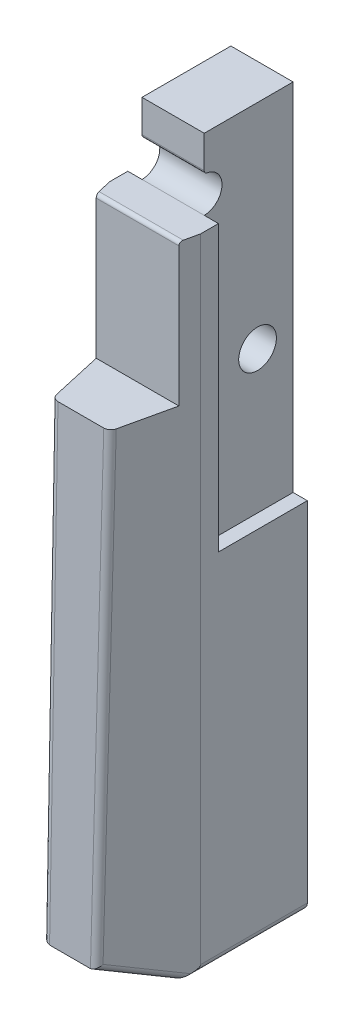
ISO-10303-21;
HEADER;
FILE_DESCRIPTION(('STEP AP214'),'2;1');
FILE_NAME('part.step','',(''),(''),'','','');
FILE_SCHEMA(('AUTOMOTIVE_DESIGN { 1 0 10303 214 1 1 1 1 }'));
ENDSEC;
DATA;
#1=APPLICATION_CONTEXT('core data for automotive mechanical design processes');
#2=APPLICATION_PROTOCOL_DEFINITION('international standard','automotive_design',2000,#1);
#3=PRODUCT_CONTEXT('',#1,'mechanical');
#4=PRODUCT('Part','Part','',(#3));
#5=PRODUCT_RELATED_PRODUCT_CATEGORY('part','',(#4));
#6=PRODUCT_DEFINITION_FORMATION('','',#4);
#7=PRODUCT_DEFINITION_CONTEXT('part definition',#1,'design');
#8=PRODUCT_DEFINITION('design','',#6,#7);
#9=PRODUCT_DEFINITION_SHAPE('','',#8);
#10=(LENGTH_UNIT() NAMED_UNIT(*) SI_UNIT(.MILLI.,.METRE.));
#11=(NAMED_UNIT(*) PLANE_ANGLE_UNIT() SI_UNIT($,.RADIAN.));
#12=(NAMED_UNIT(*) SI_UNIT($,.STERADIAN.) SOLID_ANGLE_UNIT());
#13=UNCERTAINTY_MEASURE_WITH_UNIT(LENGTH_MEASURE(1.E-05),#10,'distance_accuracy_value','');
#14=(GEOMETRIC_REPRESENTATION_CONTEXT(3) GLOBAL_UNCERTAINTY_ASSIGNED_CONTEXT((#13)) GLOBAL_UNIT_ASSIGNED_CONTEXT((#10,
#11,#12)) REPRESENTATION_CONTEXT('',''));
#15=CARTESIAN_POINT('',(0.,0.,0.));
#16=DIRECTION('',(0.,0.,1.));
#17=DIRECTION('',(1.,0.,0.));
#18=AXIS2_PLACEMENT_3D('',#15,#16,#17);
#19=CARTESIAN_POINT('',(0.5,0.,0.));
#20=DIRECTION('',(1.,0.,0.));
#21=DIRECTION('',(0.,0.,-1.));
#22=AXIS2_PLACEMENT_3D('',#19,#20,#21);
#23=PLANE('',#22);
#24=DIRECTION('',(0.,0.,-1.));
#25=VECTOR('',#24,1.);
#26=CARTESIAN_POINT('',(0.5,90.,17.5));
#27=LINE('',#26,#25);
#28=CARTESIAN_POINT('',(0.5,90.,15.));
#29=VERTEX_POINT('',#28);
#30=CARTESIAN_POINT('',(0.5,90.,12.5));
#31=VERTEX_POINT('',#30);
#32=EDGE_CURVE('E501',#29,#31,#27,.T.);
#33=ORIENTED_EDGE('',*,*,#32,.F.);
#34=DIRECTION('',(0.,-1.,0.));
#35=VECTOR('',#34,1.);
#36=CARTESIAN_POINT('',(0.5,267.953311212288,15.));
#37=LINE('',#36,#35);
#38=CARTESIAN_POINT('',(0.5,1.,15.));
#39=VERTEX_POINT('',#38);
#40=EDGE_CURVE('E516',#29,#39,#37,.T.);
#41=ORIENTED_EDGE('',*,*,#40,.T.);
#42=DIRECTION('',(0.,0.,-1.));
#43=VECTOR('',#42,1.);
#44=CARTESIAN_POINT('',(0.5,1.,0.));
#45=LINE('',#44,#43);
#46=CARTESIAN_POINT('',(0.5,1.,0.));
#47=VERTEX_POINT('',#46);
#48=EDGE_CURVE('E379',#39,#47,#45,.T.);
#49=ORIENTED_EDGE('',*,*,#48,.T.);
#50=DIRECTION('',(0.,1.,0.));
#51=VECTOR('',#50,1.);
#52=CARTESIAN_POINT('',(0.5,0.,0.));
#53=LINE('',#52,#51);
#54=CARTESIAN_POINT('',(0.5,50.,0.));
#55=VERTEX_POINT('',#54);
#56=EDGE_CURVE('E537',#47,#55,#53,.T.);
#57=ORIENTED_EDGE('',*,*,#56,.T.);
#58=DIRECTION('',(0.,0.,1.));
#59=VECTOR('',#58,1.);
#60=CARTESIAN_POINT('',(0.5,50.,12.5));
#61=LINE('',#60,#59);
#62=CARTESIAN_POINT('',(0.5,50.,12.5));
#63=VERTEX_POINT('',#62);
#64=EDGE_CURVE('E539',#55,#63,#61,.T.);
#65=ORIENTED_EDGE('',*,*,#64,.T.);
#66=DIRECTION('',(0.,1.,0.));
#67=VECTOR('',#66,1.);
#68=CARTESIAN_POINT('',(0.5,50.,12.5));
#69=LINE('',#68,#67);
#70=EDGE_CURVE('E542',#63,#31,#69,.T.);
#71=ORIENTED_EDGE('',*,*,#70,.T.);
#72=EDGE_LOOP('',(#33,#41,#49,#57,#65,#71));
#73=FACE_BOUND('',#72,.T.);
#74=ADVANCED_FACE('F43',(#73),#23,.T.);
#75=CARTESIAN_POINT('',(0.,100.,17.5));
#76=DIRECTION('',(0.,-1.,0.));
#77=DIRECTION('',(0.,0.,-1.));
#78=AXIS2_PLACEMENT_3D('',#75,#76,#77);
#79=PLANE('',#78);
#80=DIRECTION('',(0.,0.,1.));
#81=VECTOR('',#80,1.);
#82=CARTESIAN_POINT('',(-10.25,100.,0.));
#83=LINE('',#82,#81);
#84=CARTESIAN_POINT('',(-10.25,100.,0.));
#85=VERTEX_POINT('',#84);
#86=CARTESIAN_POINT('',(-10.25,100.,12.5));
#87=VERTEX_POINT('',#86);
#88=EDGE_CURVE('E234',#85,#87,#83,.T.);
#89=ORIENTED_EDGE('',*,*,#88,.T.);
#90=DIRECTION('',(1.,0.,0.));
#91=VECTOR('',#90,1.);
#92=CARTESIAN_POINT('',(-12.251,100.,12.5));
#93=LINE('',#92,#91);
#94=CARTESIAN_POINT('',(-1.5,100.,12.5));
#95=VERTEX_POINT('',#94);
#96=EDGE_CURVE('E216',#87,#95,#93,.T.);
#97=ORIENTED_EDGE('',*,*,#96,.T.);
#98=DIRECTION('',(0.,0.,1.));
#99=VECTOR('',#98,1.);
#100=CARTESIAN_POINT('',(-1.5,100.,0.));
#101=LINE('',#100,#99);
#102=CARTESIAN_POINT('',(-1.5,100.,0.));
#103=VERTEX_POINT('',#102);
#104=EDGE_CURVE('E265',#103,#95,#101,.T.);
#105=ORIENTED_EDGE('',*,*,#104,.F.);
#106=DIRECTION('',(-1.,0.,0.));
#107=VECTOR('',#106,1.);
#108=CARTESIAN_POINT('',(0.,100.,0.));
#109=LINE('',#108,#107);
#110=EDGE_CURVE('E243',#103,#85,#109,.T.);
#111=ORIENTED_EDGE('',*,*,#110,.T.);
#112=EDGE_LOOP('',(#89,#97,#105,#111));
#113=FACE_BOUND('',#112,.T.);
#114=ADVANCED_FACE('F241',(#113),#79,.F.);
#115=CARTESIAN_POINT('',(0.,0.,17.5));
#116=DIRECTION('',(0.,1.,0.));
#117=DIRECTION('',(0.,0.,1.));
#118=AXIS2_PLACEMENT_3D('',#115,#116,#117);
#119=PLANE('',#118);
#120=DIRECTION('',(1.,0.,0.));
#121=VECTOR('',#120,1.);
#122=CARTESIAN_POINT('',(0.,0.,17.2639320225002));
#123=LINE('',#122,#121);
#124=CARTESIAN_POINT('',(-0.5,0.,17.2639320225002));
#125=VERTEX_POINT('',#124);
#126=CARTESIAN_POINT('',(-11.25,0.,17.2639320225002));
#127=VERTEX_POINT('',#126);
#128=EDGE_CURVE('E289',#125,#127,#123,.F.);
#129=ORIENTED_EDGE('',*,*,#128,.T.);
#130=DIRECTION('',(0.,0.,-1.));
#131=VECTOR('',#130,1.);
#132=CARTESIAN_POINT('',(-11.25,0.,0.));
#133=LINE('',#132,#131);
#134=CARTESIAN_POINT('',(-11.25,0.,0.));
#135=VERTEX_POINT('',#134);
#136=EDGE_CURVE('E328',#127,#135,#133,.T.);
#137=ORIENTED_EDGE('',*,*,#136,.T.);
#138=DIRECTION('',(1.,0.,0.));
#139=VECTOR('',#138,1.);
#140=CARTESIAN_POINT('',(0.,0.,0.));
#141=LINE('',#140,#139);
#142=CARTESIAN_POINT('',(-0.5,0.,0.));
#143=VERTEX_POINT('',#142);
#144=EDGE_CURVE('E271',#135,#143,#141,.T.);
#145=ORIENTED_EDGE('',*,*,#144,.T.);
#146=DIRECTION('',(0.,0.,-1.));
#147=VECTOR('',#146,1.);
#148=CARTESIAN_POINT('',(-0.5,0.,15.));
#149=LINE('',#148,#147);
#150=EDGE_CURVE('E313',#143,#125,#149,.F.);
#151=ORIENTED_EDGE('',*,*,#150,.T.);
#152=EDGE_LOOP('',(#129,#137,#145,#151));
#153=FACE_BOUND('',#152,.T.);
#154=ADVANCED_FACE('F389',(#153),#119,.F.);
#155=CARTESIAN_POINT('',(0.,0.,17.5));
#156=DIRECTION('',(0.,0.,-1.));
#157=DIRECTION('',(-1.,0.,0.));
#158=AXIS2_PLACEMENT_3D('',#155,#156,#157);
#159=PLANE('',#158);
#160=DIRECTION('',(0.,-1.,0.));
#161=VECTOR('',#160,1.);
#162=CARTESIAN_POINT('',(-0.0629208161063546,0.,17.5));
#163=LINE('',#162,#161);
#164=CARTESIAN_POINT('',(-0.0629208161063546,89.5,17.5));
#165=VERTEX_POINT('',#164);
#166=CARTESIAN_POINT('',(-0.0629208161063522,70.,17.5));
#167=VERTEX_POINT('',#166);
#168=EDGE_CURVE('E518',#165,#167,#163,.T.);
#169=ORIENTED_EDGE('',*,*,#168,.F.);
#170=DIRECTION('',(1.,0.,0.));
#171=VECTOR('',#170,1.);
#172=CARTESIAN_POINT('',(0.,89.5,17.5));
#173=LINE('',#172,#171);
#174=CARTESIAN_POINT('',(-11.6870791838936,89.5,17.5));
#175=VERTEX_POINT('',#174);
#176=EDGE_CURVE('E568',#165,#175,#173,.F.);
#177=ORIENTED_EDGE('',*,*,#176,.T.);
#178=DIRECTION('',(0.,-1.,0.));
#179=VECTOR('',#178,1.);
#180=CARTESIAN_POINT('',(-11.6870791838936,0.,17.5));
#181=LINE('',#180,#179);
#182=CARTESIAN_POINT('',(-11.6870791838936,70.,17.5));
#183=VERTEX_POINT('',#182);
#184=EDGE_CURVE('E514',#175,#183,#181,.T.);
#185=ORIENTED_EDGE('',*,*,#184,.T.);
#186=DIRECTION('',(1.,0.,0.));
#187=VECTOR('',#186,1.);
#188=CARTESIAN_POINT('',(-12.25,70.,17.5));
#189=LINE('',#188,#187);
#190=EDGE_CURVE('E520',#183,#167,#189,.T.);
#191=ORIENTED_EDGE('',*,*,#190,.T.);
#192=EDGE_LOOP('',(#169,#177,#185,#191));
#193=FACE_BOUND('',#192,.T.);
#194=ADVANCED_FACE('F392',(#193),#159,.F.);
#195=CARTESIAN_POINT('',(-12.25,-7.,3.5));
#196=DIRECTION('',(0.,0.894427190999916,-0.447213595499958));
#197=DIRECTION('',(0.,0.447213595499958,0.894427190999916));
#198=AXIS2_PLACEMENT_3D('',#195,#196,#197);
#199=PLANE('',#198);
#200=DIRECTION('',(1.,0.,0.));
#201=VECTOR('',#200,1.);
#202=CARTESIAN_POINT('',(-12.25,4.75,27.));
#203=LINE('',#202,#201);
#204=CARTESIAN_POINT('',(-8.62364145668878,4.75,27.));
#205=VERTEX_POINT('',#204);
#206=CARTESIAN_POINT('',(-3.12635854331123,4.75,27.));
#207=VERTEX_POINT('',#206);
#208=EDGE_CURVE('E521',#205,#207,#203,.T.);
#209=ORIENTED_EDGE('',*,*,#208,.F.);
#210=DIRECTION('',(-0.197432479803604,-0.438410861160761,-0.876821722321522));
#211=VECTOR('',#210,1.);
#212=CARTESIAN_POINT('',(-13.8501923345805,-6.85587494801453,3.78825010397094));
#213=LINE('',#212,#211);
#214=CARTESIAN_POINT('',(-10.7151972524522,0.105572809000083,17.7111456180002));
#215=VERTEX_POINT('',#214);
#216=EDGE_CURVE('E287',#205,#215,#213,.T.);
#217=ORIENTED_EDGE('',*,*,#216,.T.);
#218=DIRECTION('',(1.,0.,0.));
#219=VECTOR('',#218,1.);
#220=CARTESIAN_POINT('',(-12.25,0.105572809000084,17.7111456180002));
#221=LINE('',#220,#219);
#222=CARTESIAN_POINT('',(-1.03480274754785,0.105572809000083,17.7111456180002));
#223=VERTEX_POINT('',#222);
#224=EDGE_CURVE('E284',#215,#223,#221,.T.);
#225=ORIENTED_EDGE('',*,*,#224,.T.);
#226=DIRECTION('',(0.197432479803604,-0.438410861160761,-0.876821722321522));
#227=VECTOR('',#226,1.);
#228=CARTESIAN_POINT('',(-3.09032820810796,4.66999244349215,26.8399848869843));
#229=LINE('',#228,#227);
#230=EDGE_CURVE('E282',#223,#207,#229,.F.);
#231=ORIENTED_EDGE('',*,*,#230,.T.);
#232=EDGE_LOOP('',(#209,#217,#225,#231));
#233=FACE_BOUND('',#232,.T.);
#234=ADVANCED_FACE('F405',(#233),#199,.F.);
#235=CARTESIAN_POINT('',(-12.25,0.63569556061713,27.0965232713052));
#236=DIRECTION('',(0.,-0.0234539570232247,-0.999724918114955));
#237=DIRECTION('',(0.,0.999724918114955,-0.0234539570232247));
#238=AXIS2_PLACEMENT_3D('',#235,#236,#237);
#239=PLANE('',#238);
#240=ORIENTED_EDGE('',*,*,#208,.T.);
#241=CARTESIAN_POINT('',(-3.22121929542673,5.85507127583682,26.9740745741739));
#242=DIRECTION('',(0.,-0.0234539570232247,-0.999724918114955));
#243=DIRECTION('',(-0.427312971247492,0.903855066145458,-0.0212048109359638));
#244=AXIS2_PLACEMENT_3D('',#241,#242,#243);
#245=ELLIPSE('',#244,1.12756988025675,1.);
#246=CARTESIAN_POINT('',(-3.00190637975444,4.75835084854123,26.9998040856647));
#247=VERTEX_POINT('',#246);
#248=EDGE_CURVE('E302',#207,#247,#245,.F.);
#249=ORIENTED_EDGE('',*,*,#248,.T.);
#250=DIRECTION('',(-0.00528101460842179,-0.999710977296003,0.0234536299658886));
#251=VECTOR('',#250,1.);
#252=CARTESIAN_POINT('',(-2.65724235887262,70.0042232240979,25.4691091325725));
#253=LINE('',#252,#251);
#254=CARTESIAN_POINT('',(-2.65726466822869,70.,25.4692082111437));
#255=VERTEX_POINT('',#254);
#256=EDGE_CURVE('E300',#247,#255,#253,.F.);
#257=ORIENTED_EDGE('',*,*,#256,.T.);
#258=DIRECTION('',(1.,0.,0.));
#259=VECTOR('',#258,1.);
#260=CARTESIAN_POINT('',(-12.25,70.,25.4692082111437));
#261=LINE('',#260,#259);
#262=CARTESIAN_POINT('',(-9.09273533177131,70.,25.4692082111437));
#263=VERTEX_POINT('',#262);
#264=EDGE_CURVE('E525',#263,#255,#261,.T.);
#265=ORIENTED_EDGE('',*,*,#264,.F.);
#266=DIRECTION('',(0.00528101460842179,-0.999710977296003,0.0234536299658886));
#267=VECTOR('',#266,1.);
#268=CARTESIAN_POINT('',(-8.72641379552265,0.654298811498885,27.0960868314018));
#269=LINE('',#268,#267);
#270=CARTESIAN_POINT('',(-8.74809362024556,4.75835084854129,26.9998040856647));
#271=VERTEX_POINT('',#270);
#272=EDGE_CURVE('E296',#263,#271,#269,.T.);
#273=ORIENTED_EDGE('',*,*,#272,.T.);
#274=CARTESIAN_POINT('',(-8.52878070457327,5.85507127583685,26.9740745741739));
#275=DIRECTION('',(0.,-0.0234539570232247,-0.999724918114955));
#276=DIRECTION('',(-0.427312971247492,-0.903855066145458,0.0212048109359638));
#277=AXIS2_PLACEMENT_3D('',#274,#275,#276);
#278=ELLIPSE('',#277,1.12756988025675,1.);
#279=EDGE_CURVE('E298',#271,#205,#278,.F.);
#280=ORIENTED_EDGE('',*,*,#279,.T.);
#281=EDGE_LOOP('',(#240,#249,#257,#265,#273,#280));
#282=FACE_BOUND('',#281,.T.);
#283=ADVANCED_FACE('F441',(#282),#239,.F.);
#284=CARTESIAN_POINT('',(-12.25,70.,0.));
#285=DIRECTION('',(0.,1.,0.));
#286=DIRECTION('',(0.,0.,1.));
#287=AXIS2_PLACEMENT_3D('',#284,#285,#286);
#288=PLANE('',#287);
#289=ORIENTED_EDGE('',*,*,#264,.T.);
#290=CARTESIAN_POINT('',(-2.65714077173012,70.,24.4689330535678));
#291=DIRECTION('',(0.,1.,0.));
#292=DIRECTION('',(0.219668494503745,0.,-0.975574575582235));
#293=AXIS2_PLACEMENT_3D('',#290,#291,#292);
#294=ELLIPSE('',#293,1.00028910626227,1.);
#295=CARTESIAN_POINT('',(-1.68156619614788,70.,24.6886015480715));
#296=VERTEX_POINT('',#295);
#297=EDGE_CURVE('E311',#255,#296,#294,.T.);
#298=ORIENTED_EDGE('',*,*,#297,.T.);
#299=DIRECTION('',(0.219668494503745,0.,-0.975574575582235));
#300=VECTOR('',#299,1.);
#301=CARTESIAN_POINT('',(3.09930331907554,70.,3.45617694041519));
#302=LINE('',#301,#300);
#303=EDGE_CURVE('E276',#296,#167,#302,.T.);
#304=ORIENTED_EDGE('',*,*,#303,.T.);
#305=ORIENTED_EDGE('',*,*,#190,.F.);
#306=DIRECTION('',(-0.219668494503745,0.,-0.975574575582235));
#307=VECTOR('',#306,1.);
#308=CARTESIAN_POINT('',(-15.4645449744142,70.,0.723813712163128));
#309=LINE('',#308,#307);
#310=CARTESIAN_POINT('',(-10.0684338038521,70.,24.6886015480715));
#311=VERTEX_POINT('',#310);
#312=EDGE_CURVE('E279',#311,#183,#309,.T.);
#313=ORIENTED_EDGE('',*,*,#312,.F.);
#314=CARTESIAN_POINT('',(-9.09285922826988,70.,24.4689330535678));
#315=DIRECTION('',(0.,1.,0.));
#316=DIRECTION('',(0.219668494503745,0.,0.975574575582235));
#317=AXIS2_PLACEMENT_3D('',#314,#315,#316);
#318=ELLIPSE('',#317,1.00028910626227,1.);
#319=EDGE_CURVE('E309',#311,#263,#318,.T.);
#320=ORIENTED_EDGE('',*,*,#319,.T.);
#321=EDGE_LOOP('',(#289,#298,#304,#305,#313,#320));
#322=FACE_BOUND('',#321,.T.);
#323=ADVANCED_FACE('F409',(#322),#288,.T.);
#324=CARTESIAN_POINT('',(-11.75,70.,5.));
#325=DIRECTION('',(1.,0.,0.));
#326=DIRECTION('',(0.,0.,-1.));
#327=AXIS2_PLACEMENT_3D('',#324,#325,#326);
#328=CYLINDRICAL_SURFACE('',#327,2.65);
#329=CARTESIAN_POINT('',(-1.5,70.,5.));
#330=DIRECTION('',(1.,0.,0.));
#331=DIRECTION('',(0.,0.,-1.));
#332=AXIS2_PLACEMENT_3D('',#329,#330,#331);
#333=CIRCLE('',#332,2.65);
#334=CARTESIAN_POINT('',(-1.5,70.,2.35));
#335=VERTEX_POINT('',#334);
#336=EDGE_CURVE('E254',#335,#335,#333,.F.);
#337=ORIENTED_EDGE('',*,*,#336,.F.);
#338=EDGE_LOOP('',(#337));
#339=FACE_BOUND('',#338,.T.);
#340=CARTESIAN_POINT('',(-10.25,70.,5.));
#341=DIRECTION('',(1.,0.,0.));
#342=DIRECTION('',(0.,0.,-1.));
#343=AXIS2_PLACEMENT_3D('',#340,#341,#342);
#344=CIRCLE('',#343,2.65);
#345=CARTESIAN_POINT('',(-10.25,70.,2.35));
#346=VERTEX_POINT('',#345);
#347=EDGE_CURVE('E544',#346,#346,#344,.F.);
#348=ORIENTED_EDGE('',*,*,#347,.T.);
#349=EDGE_LOOP('',(#348));
#350=FACE_BOUND('',#349,.T.);
#351=ADVANCED_FACE('F400',(#339,#350),#328,.F.);
#352=CARTESIAN_POINT('',(0.,0.,0.));
#353=DIRECTION('',(0.,0.,-1.));
#354=DIRECTION('',(-1.,0.,0.));
#355=AXIS2_PLACEMENT_3D('',#352,#353,#354);
#356=PLANE('',#355);
#357=CARTESIAN_POINT('',(-5.875,13.5,0.));
#358=DIRECTION('',(0.,0.,-1.));
#359=DIRECTION('',(-1.,0.,0.));
#360=AXIS2_PLACEMENT_3D('',#357,#358,#359);
#361=CIRCLE('',#360,3.2);
#362=CARTESIAN_POINT('',(-9.075,13.5,0.));
#363=VERTEX_POINT('',#362);
#364=EDGE_CURVE('E488',#363,#363,#361,.T.);
#365=ORIENTED_EDGE('',*,*,#364,.F.);
#366=EDGE_LOOP('',(#365));
#367=FACE_BOUND('',#366,.T.);
#368=ORIENTED_EDGE('',*,*,#144,.F.);
#369=CARTESIAN_POINT('',(-11.25,1.,0.));
#370=DIRECTION('',(0.,0.,-1.));
#371=DIRECTION('',(-1.,0.,0.));
#372=AXIS2_PLACEMENT_3D('',#369,#370,#371);
#373=CIRCLE('',#372,1.);
#374=CARTESIAN_POINT('',(-12.25,1.,0.));
#375=VERTEX_POINT('',#374);
#376=EDGE_CURVE('E333',#135,#375,#373,.T.);
#377=ORIENTED_EDGE('',*,*,#376,.T.);
#378=DIRECTION('',(0.,1.,0.));
#379=VECTOR('',#378,1.);
#380=CARTESIAN_POINT('',(-12.25,0.,0.));
#381=LINE('',#380,#379);
#382=CARTESIAN_POINT('',(-12.25,50.,0.));
#383=VERTEX_POINT('',#382);
#384=EDGE_CURVE('E535',#375,#383,#381,.T.);
#385=ORIENTED_EDGE('',*,*,#384,.T.);
#386=DIRECTION('',(-1.,0.,0.));
#387=VECTOR('',#386,1.);
#388=CARTESIAN_POINT('',(-10.25,50.,0.));
#389=LINE('',#388,#387);
#390=CARTESIAN_POINT('',(-10.25,50.,0.));
#391=VERTEX_POINT('',#390);
#392=EDGE_CURVE('E251',#391,#383,#389,.T.);
#393=ORIENTED_EDGE('',*,*,#392,.F.);
#394=DIRECTION('',(0.,1.,0.));
#395=VECTOR('',#394,1.);
#396=CARTESIAN_POINT('',(-10.25,0.,0.));
#397=LINE('',#396,#395);
#398=EDGE_CURVE('E244',#391,#85,#397,.T.);
#399=ORIENTED_EDGE('',*,*,#398,.T.);
#400=ORIENTED_EDGE('',*,*,#110,.F.);
#401=DIRECTION('',(0.,1.,0.));
#402=VECTOR('',#401,1.);
#403=CARTESIAN_POINT('',(-1.5,0.,0.));
#404=LINE('',#403,#402);
#405=CARTESIAN_POINT('',(-1.5,50.,0.));
#406=VERTEX_POINT('',#405);
#407=EDGE_CURVE('E263',#406,#103,#404,.T.);
#408=ORIENTED_EDGE('',*,*,#407,.F.);
#409=DIRECTION('',(1.,0.,0.));
#410=VECTOR('',#409,1.);
#411=CARTESIAN_POINT('',(-1.5,50.,0.));
#412=LINE('',#411,#410);
#413=EDGE_CURVE('E268',#406,#55,#412,.T.);
#414=ORIENTED_EDGE('',*,*,#413,.T.);
#415=ORIENTED_EDGE('',*,*,#56,.F.);
#416=CARTESIAN_POINT('',(-0.5,1.,0.));
#417=DIRECTION('',(0.,0.,-1.));
#418=DIRECTION('',(-1.,0.,0.));
#419=AXIS2_PLACEMENT_3D('',#416,#417,#418);
#420=CIRCLE('',#419,1.);
#421=EDGE_CURVE('E331',#47,#143,#420,.T.);
#422=ORIENTED_EDGE('',*,*,#421,.T.);
#423=EDGE_LOOP('',(#368,#377,#385,#393,#399,#400,#408,#414,#415,#422));
#424=FACE_BOUND('',#423,.T.);
#425=ADVANCED_FACE('F396',(#367,#424),#356,.T.);
#426=CARTESIAN_POINT('',(-1.5,0.,12.5));
#427=DIRECTION('',(0.,0.,1.));
#428=DIRECTION('',(0.,-1.,0.));
#429=AXIS2_PLACEMENT_3D('',#426,#427,#428);
#430=PLANE('',#429);
#431=DIRECTION('',(0.,-1.,0.));
#432=VECTOR('',#431,1.);
#433=CARTESIAN_POINT('',(-1.5,0.,12.5));
#434=LINE('',#433,#432);
#435=CARTESIAN_POINT('',(-1.5,90.,12.5));
#436=VERTEX_POINT('',#435);
#437=CARTESIAN_POINT('',(-1.5,50.,12.5));
#438=VERTEX_POINT('',#437);
#439=EDGE_CURVE('E259',#436,#438,#434,.T.);
#440=ORIENTED_EDGE('',*,*,#439,.F.);
#441=DIRECTION('',(-1.,0.,0.));
#442=VECTOR('',#441,1.);
#443=CARTESIAN_POINT('',(-12.251,90.,12.5));
#444=LINE('',#443,#442);
#445=EDGE_CURVE('E495',#31,#436,#444,.T.);
#446=ORIENTED_EDGE('',*,*,#445,.F.);
#447=ORIENTED_EDGE('',*,*,#70,.F.);
#448=DIRECTION('',(1.,0.,0.));
#449=VECTOR('',#448,1.);
#450=CARTESIAN_POINT('',(-1.5,50.,12.5));
#451=LINE('',#450,#449);
#452=EDGE_CURVE('E267',#438,#63,#451,.T.);
#453=ORIENTED_EDGE('',*,*,#452,.F.);
#454=EDGE_LOOP('',(#440,#446,#447,#453));
#455=FACE_BOUND('',#454,.T.);
#456=ADVANCED_FACE('F399',(#455),#430,.F.);
#457=CARTESIAN_POINT('',(-1.5,50.,0.));
#458=DIRECTION('',(0.,-1.,0.));
#459=DIRECTION('',(0.,0.,-1.));
#460=AXIS2_PLACEMENT_3D('',#457,#458,#459);
#461=PLANE('',#460);
#462=ORIENTED_EDGE('',*,*,#452,.T.);
#463=ORIENTED_EDGE('',*,*,#64,.F.);
#464=ORIENTED_EDGE('',*,*,#413,.F.);
#465=DIRECTION('',(0.,0.,-1.));
#466=VECTOR('',#465,1.);
#467=CARTESIAN_POINT('',(-1.5,50.,0.));
#468=LINE('',#467,#466);
#469=EDGE_CURVE('E261',#438,#406,#468,.T.);
#470=ORIENTED_EDGE('',*,*,#469,.F.);
#471=EDGE_LOOP('',(#462,#463,#464,#470));
#472=FACE_BOUND('',#471,.T.);
#473=ADVANCED_FACE('F413',(#472),#461,.F.);
#474=CARTESIAN_POINT('',(-1.5,0.,0.));
#475=DIRECTION('',(1.,0.,0.));
#476=DIRECTION('',(0.,0.,-1.));
#477=AXIS2_PLACEMENT_3D('',#474,#475,#476);
#478=PLANE('',#477);
#479=CARTESIAN_POINT('',(-1.5,95.4580398915498,12.5));
#480=VERTEX_POINT('',#479);
#481=EDGE_CURVE('E222',#95,#480,#434,.T.);
#482=ORIENTED_EDGE('',*,*,#481,.T.);
#483=CARTESIAN_POINT('',(-1.5,95.4580398915498,12.));
#484=DIRECTION('',(1.,0.,0.));
#485=DIRECTION('',(0.,0.,-1.));
#486=AXIS2_PLACEMENT_3D('',#483,#484,#485);
#487=CIRCLE('',#486,0.5);
#488=CARTESIAN_POINT('',(-1.5,94.9650332429582,12.0833333333333));
#489=VERTEX_POINT('',#488);
#490=EDGE_CURVE('E66',#480,#489,#487,.T.);
#491=ORIENTED_EDGE('',*,*,#490,.T.);
#492=CARTESIAN_POINT('',(-1.5,92.5,12.5));
#493=DIRECTION('',(1.,0.,0.));
#494=DIRECTION('',(0.,0.,-1.));
#495=AXIS2_PLACEMENT_3D('',#492,#493,#494);
#496=CIRCLE('',#495,2.5);
#497=EDGE_CURVE('E317',#489,#436,#496,.F.);
#498=ORIENTED_EDGE('',*,*,#497,.T.);
#499=ORIENTED_EDGE('',*,*,#439,.T.);
#500=ORIENTED_EDGE('',*,*,#469,.T.);
#501=ORIENTED_EDGE('',*,*,#407,.T.);
#502=ORIENTED_EDGE('',*,*,#104,.T.);
#503=EDGE_LOOP('',(#482,#491,#498,#499,#500,#501,#502));
#504=FACE_BOUND('',#503,.T.);
#505=ORIENTED_EDGE('',*,*,#336,.T.);
#506=EDGE_LOOP('',(#505));
#507=FACE_BOUND('',#506,.T.);
#508=ADVANCED_FACE('F417',(#504,#507),#478,.T.);
#509=CARTESIAN_POINT('',(-10.25,0.,12.5));
#510=DIRECTION('',(0.,0.,-1.));
#511=DIRECTION('',(0.,1.,0.));
#512=AXIS2_PLACEMENT_3D('',#509,#510,#511);
#513=PLANE('',#512);
#514=DIRECTION('',(1.,0.,0.));
#515=VECTOR('',#514,1.);
#516=CARTESIAN_POINT('',(-12.251,90.,12.5));
#517=LINE('',#516,#515);
#518=CARTESIAN_POINT('',(-12.25,90.,12.5));
#519=VERTEX_POINT('',#518);
#520=CARTESIAN_POINT('',(-10.25,90.,12.5));
#521=VERTEX_POINT('',#520);
#522=EDGE_CURVE('E506',#519,#521,#517,.T.);
#523=ORIENTED_EDGE('',*,*,#522,.T.);
#524=DIRECTION('',(0.,-1.,0.));
#525=VECTOR('',#524,1.);
#526=CARTESIAN_POINT('',(-10.25,0.,12.5));
#527=LINE('',#526,#525);
#528=CARTESIAN_POINT('',(-10.25,50.,12.5));
#529=VERTEX_POINT('',#528);
#530=EDGE_CURVE('E238',#521,#529,#527,.T.);
#531=ORIENTED_EDGE('',*,*,#530,.T.);
#532=DIRECTION('',(-1.,0.,0.));
#533=VECTOR('',#532,1.);
#534=CARTESIAN_POINT('',(-10.25,50.,12.5));
#535=LINE('',#534,#533);
#536=CARTESIAN_POINT('',(-12.25,50.,12.5));
#537=VERTEX_POINT('',#536);
#538=EDGE_CURVE('E252',#529,#537,#535,.T.);
#539=ORIENTED_EDGE('',*,*,#538,.T.);
#540=DIRECTION('',(0.,1.,0.));
#541=VECTOR('',#540,1.);
#542=CARTESIAN_POINT('',(-12.25,50.,12.5));
#543=LINE('',#542,#541);
#544=EDGE_CURVE('E524',#537,#519,#543,.T.);
#545=ORIENTED_EDGE('',*,*,#544,.T.);
#546=EDGE_LOOP('',(#523,#531,#539,#545));
#547=FACE_BOUND('',#546,.T.);
#548=ADVANCED_FACE('F421',(#547),#513,.T.);
#549=CARTESIAN_POINT('',(-10.25,50.,0.));
#550=DIRECTION('',(0.,1.,0.));
#551=DIRECTION('',(0.,0.,1.));
#552=AXIS2_PLACEMENT_3D('',#549,#550,#551);
#553=PLANE('',#552);
#554=ORIENTED_EDGE('',*,*,#392,.T.);
#555=DIRECTION('',(0.,0.,1.));
#556=VECTOR('',#555,1.);
#557=CARTESIAN_POINT('',(-12.25,50.,12.5));
#558=LINE('',#557,#556);
#559=EDGE_CURVE('E532',#383,#537,#558,.T.);
#560=ORIENTED_EDGE('',*,*,#559,.T.);
#561=ORIENTED_EDGE('',*,*,#538,.F.);
#562=DIRECTION('',(0.,0.,-1.));
#563=VECTOR('',#562,1.);
#564=CARTESIAN_POINT('',(-10.25,50.,0.));
#565=LINE('',#564,#563);
#566=EDGE_CURVE('E246',#529,#391,#565,.T.);
#567=ORIENTED_EDGE('',*,*,#566,.T.);
#568=EDGE_LOOP('',(#554,#560,#561,#567));
#569=FACE_BOUND('',#568,.T.);
#570=ADVANCED_FACE('F424',(#569),#553,.T.);
#571=CARTESIAN_POINT('',(-10.25,0.,0.));
#572=DIRECTION('',(-1.,0.,0.));
#573=DIRECTION('',(0.,0.,-1.));
#574=AXIS2_PLACEMENT_3D('',#571,#572,#573);
#575=PLANE('',#574);
#576=CARTESIAN_POINT('',(-10.25,92.5,12.5));
#577=DIRECTION('',(-1.,0.,0.));
#578=DIRECTION('',(0.,0.,1.));
#579=AXIS2_PLACEMENT_3D('',#576,#577,#578);
#580=CIRCLE('',#579,2.5);
#581=CARTESIAN_POINT('',(-10.25,94.9650332429582,12.0833333333333));
#582=VERTEX_POINT('',#581);
#583=EDGE_CURVE('E510',#521,#582,#580,.F.);
#584=ORIENTED_EDGE('',*,*,#583,.T.);
#585=CARTESIAN_POINT('',(-10.25,95.4580398915498,12.));
#586=DIRECTION('',(-1.,0.,0.));
#587=DIRECTION('',(0.,0.,1.));
#588=AXIS2_PLACEMENT_3D('',#585,#586,#587);
#589=CIRCLE('',#588,0.5);
#590=CARTESIAN_POINT('',(-10.25,95.4580398915498,12.5));
#591=VERTEX_POINT('',#590);
#592=EDGE_CURVE('E237',#582,#591,#589,.T.);
#593=ORIENTED_EDGE('',*,*,#592,.T.);
#594=EDGE_CURVE('E220',#87,#591,#527,.T.);
#595=ORIENTED_EDGE('',*,*,#594,.F.);
#596=ORIENTED_EDGE('',*,*,#88,.F.);
#597=ORIENTED_EDGE('',*,*,#398,.F.);
#598=ORIENTED_EDGE('',*,*,#566,.F.);
#599=ORIENTED_EDGE('',*,*,#530,.F.);
#600=EDGE_LOOP('',(#584,#593,#595,#596,#597,#598,#599));
#601=FACE_BOUND('',#600,.T.);
#602=ORIENTED_EDGE('',*,*,#347,.F.);
#603=EDGE_LOOP('',(#602));
#604=FACE_BOUND('',#603,.T.);
#605=ADVANCED_FACE('F231',(#601,#604),#575,.T.);
#606=CARTESIAN_POINT('',(-12.25,0.,0.));
#607=DIRECTION('',(-1.,0.,0.));
#608=DIRECTION('',(0.,0.,-1.));
#609=AXIS2_PLACEMENT_3D('',#606,#607,#608);
#610=PLANE('',#609);
#611=DIRECTION('',(0.,0.,-1.));
#612=VECTOR('',#611,1.);
#613=CARTESIAN_POINT('',(-12.25,90.,17.5));
#614=LINE('',#613,#612);
#615=CARTESIAN_POINT('',(-12.25,90.,15.));
#616=VERTEX_POINT('',#615);
#617=EDGE_CURVE('E507',#616,#519,#614,.T.);
#618=ORIENTED_EDGE('',*,*,#617,.T.);
#619=ORIENTED_EDGE('',*,*,#544,.F.);
#620=ORIENTED_EDGE('',*,*,#559,.F.);
#621=ORIENTED_EDGE('',*,*,#384,.F.);
#622=DIRECTION('',(0.,0.,-1.));
#623=VECTOR('',#622,1.);
#624=CARTESIAN_POINT('',(-12.25,1.,15.));
#625=LINE('',#624,#623);
#626=CARTESIAN_POINT('',(-12.25,1.,15.));
#627=VERTEX_POINT('',#626);
#628=EDGE_CURVE('E335',#375,#627,#625,.F.);
#629=ORIENTED_EDGE('',*,*,#628,.T.);
#630=DIRECTION('',(0.,-1.,0.));
#631=VECTOR('',#630,1.);
#632=CARTESIAN_POINT('',(-12.25,230.453311212288,15.));
#633=LINE('',#632,#631);
#634=EDGE_CURVE('E326',#616,#627,#633,.T.);
#635=ORIENTED_EDGE('',*,*,#634,.F.);
#636=EDGE_LOOP('',(#618,#619,#620,#621,#629,#635));
#637=FACE_BOUND('',#636,.T.);
#638=ADVANCED_FACE('F431',(#637),#610,.T.);
#639=CARTESIAN_POINT('',(0.5,267.953311212288,15.));
#640=DIRECTION('',(0.975574575582235,0.,0.219668494503745));
#641=DIRECTION('',(0.219668494503745,0.,-0.975574575582235));
#642=AXIS2_PLACEMENT_3D('',#639,#640,#641);
#643=PLANE('',#642);
#644=DIRECTION('',(-0.219668494503745,0.,0.975574575582235));
#645=VECTOR('',#644,1.);
#646=CARTESIAN_POINT('',(-0.651047405321833,90.,20.1119419125565));
#647=LINE('',#646,#645);
#648=CARTESIAN_POINT('',(0.0496633471149169,90.,17.));
#649=VERTEX_POINT('',#648);
#650=EDGE_CURVE('E227',#29,#649,#647,.T.);
#651=ORIENTED_EDGE('',*,*,#650,.T.);
#652=CARTESIAN_POINT('',(0.0496633471149185,89.5,17.));
#653=DIRECTION('',(0.975574575582235,0.,0.219668494503745));
#654=DIRECTION('',(0.219668494503745,0.,-0.975574575582235));
#655=AXIS2_PLACEMENT_3D('',#652,#653,#654);
#656=ELLIPSE('',#655,0.512518481430898,0.5);
#657=EDGE_CURVE('E571',#649,#165,#656,.T.);
#658=ORIENTED_EDGE('',*,*,#657,.T.);
#659=ORIENTED_EDGE('',*,*,#168,.T.);
#660=ORIENTED_EDGE('',*,*,#303,.F.);
#661=DIRECTION('',(-0.00528101460842179,-0.999710977296003,0.0234536299658886));
#662=VECTOR('',#661,1.);
#663=CARTESIAN_POINT('',(-2.02635360851986,4.73076926693994,26.2198444978207));
#664=LINE('',#663,#662);
#665=CARTESIAN_POINT('',(-2.02302580223355,5.36073239361452,26.2050653042331));
#666=VERTEX_POINT('',#665);
#667=EDGE_CURVE('E304',#296,#666,#664,.T.);
#668=ORIENTED_EDGE('',*,*,#667,.T.);
#669=DIRECTION('',(0.197432479803604,-0.438410861160761,-0.876821722321522));
#670=VECTOR('',#669,1.);
#671=CARTESIAN_POINT('',(0.0243454686670479,0.81441963451729,17.1124397860386));
#672=LINE('',#671,#670);
#673=CARTESIAN_POINT('',(0.242452014426983,0.330100749162001,16.143802015328));
#674=VERTEX_POINT('',#673);
#675=EDGE_CURVE('E306',#666,#674,#672,.T.);
#676=ORIENTED_EDGE('',*,*,#675,.T.);
#677=CARTESIAN_POINT('',(-0.5,1.,19.4411219632846));
#678=DIRECTION('',(0.975574575582235,0.,0.219668494503745));
#679=DIRECTION('',(-0.219668494503745,0.,0.975574575582235));
#680=AXIS2_PLACEMENT_3D('',#677,#678,#679);
#681=ELLIPSE('',#680,4.55231416894402,1.);
#682=EDGE_CURVE('E378',#674,#39,#681,.T.);
#683=ORIENTED_EDGE('',*,*,#682,.T.);
#684=ORIENTED_EDGE('',*,*,#40,.F.);
#685=EDGE_LOOP('',(#651,#658,#659,#660,#668,#676,#683,#684));
#686=FACE_BOUND('',#685,.T.);
#687=ADVANCED_FACE('F437',(#686),#643,.T.);
#688=CARTESIAN_POINT('',(-12.25,230.453311212288,15.));
#689=DIRECTION('',(0.975574575582235,0.,-0.219668494503745));
#690=DIRECTION('',(-0.219668494503745,0.,-0.975574575582235));
#691=AXIS2_PLACEMENT_3D('',#688,#689,#690);
#692=PLANE('',#691);
#693=ORIENTED_EDGE('',*,*,#184,.F.);
#694=CARTESIAN_POINT('',(-11.7996633471149,89.5,17.));
#695=DIRECTION('',(0.975574575582235,0.,-0.219668494503745));
#696=DIRECTION('',(0.219668494503745,0.,0.975574575582235));
#697=AXIS2_PLACEMENT_3D('',#694,#695,#696);
#698=ELLIPSE('',#697,0.512518481430898,0.5);
#699=CARTESIAN_POINT('',(-11.7996633471149,90.,17.));
#700=VERTEX_POINT('',#699);
#701=EDGE_CURVE('E564',#175,#700,#698,.F.);
#702=ORIENTED_EDGE('',*,*,#701,.T.);
#703=DIRECTION('',(0.219668494503745,0.,0.975574575582235));
#704=VECTOR('',#703,1.);
#705=CARTESIAN_POINT('',(-11.7142907585118,90.,17.3791500783079));
#706=LINE('',#705,#704);
#707=EDGE_CURVE('E498',#616,#700,#706,.T.);
#708=ORIENTED_EDGE('',*,*,#707,.F.);
#709=ORIENTED_EDGE('',*,*,#634,.T.);
#710=CARTESIAN_POINT('',(-11.25,1.,19.4411219632846));
#711=DIRECTION('',(0.975574575582235,0.,-0.219668494503745));
#712=DIRECTION('',(0.219668494503745,0.,0.975574575582235));
#713=AXIS2_PLACEMENT_3D('',#710,#711,#712);
#714=ELLIPSE('',#713,4.55231416894402,1.);
#715=CARTESIAN_POINT('',(-11.992452014427,0.330100749162013,16.1438020153279));
#716=VERTEX_POINT('',#715);
#717=EDGE_CURVE('E338',#627,#716,#714,.F.);
#718=ORIENTED_EDGE('',*,*,#717,.T.);
#719=DIRECTION('',(-0.197432479803604,-0.438410861160761,-0.876821722321522));
#720=VECTOR('',#719,1.);
#721=CARTESIAN_POINT('',(7.71817144936766,44.0987421367073,103.681084790418));
#722=LINE('',#721,#720);
#723=CARTESIAN_POINT('',(-9.72697419776645,5.36073239361456,26.2050653042331));
#724=VERTEX_POINT('',#723);
#725=EDGE_CURVE('E294',#716,#724,#722,.F.);
#726=ORIENTED_EDGE('',*,*,#725,.T.);
#727=DIRECTION('',(0.00528101460842179,-0.999710977296003,0.0234536299658886));
#728=VECTOR('',#727,1.);
#729=CARTESIAN_POINT('',(-10.9168060412171,230.59926006916,20.9208769716689));
#730=LINE('',#729,#728);
#731=EDGE_CURVE('E292',#724,#311,#730,.F.);
#732=ORIENTED_EDGE('',*,*,#731,.T.);
#733=ORIENTED_EDGE('',*,*,#312,.T.);
#734=EDGE_LOOP('',(#693,#702,#708,#709,#718,#726,#732,#733));
#735=FACE_BOUND('',#734,.T.);
#736=ADVANCED_FACE('F451',(#735),#692,.F.);
#737=CARTESIAN_POINT('',(-8.72641379552265,0.63084485447566,26.0963619132868));
#738=DIRECTION('',(0.00528101460842179,-0.999710977296003,0.0234536299658886));
#739=DIRECTION('',(0.,-0.0234539570232247,-0.999724918114955));
#740=AXIS2_PLACEMENT_3D('',#737,#738,#739);
#741=CYLINDRICAL_SURFACE('',#740,1.);
#742=ORIENTED_EDGE('',*,*,#319,.F.);
#743=ORIENTED_EDGE('',*,*,#731,.F.);
#744=CARTESIAN_POINT('',(-8.75139962218421,5.36073239361456,25.9853968097293));
#745=DIRECTION('',(-0.114154570222451,-0.854368610875777,-0.506974369024237));
#746=DIRECTION('',(0.187677866502338,-0.519667467473379,0.83350029494592));
#747=AXIS2_PLACEMENT_3D('',#744,#745,#746);
#748=ELLIPSE('',#747,1.18817277928634,1.);
#749=EDGE_CURVE('E323',#271,#724,#748,.T.);
#750=ORIENTED_EDGE('',*,*,#749,.F.);
#751=ORIENTED_EDGE('',*,*,#272,.F.);
#752=EDGE_LOOP('',(#742,#743,#750,#751));
#753=FACE_BOUND('',#752,.T.);
#754=ADVANCED_FACE('F362',(#753),#741,.T.);
#755=CARTESIAN_POINT('',(-1.61078772404137,268.07758649889,19.8219515521276));
#756=DIRECTION('',(0.00528101460842179,0.999710977296003,-0.0234536299658886));
#757=DIRECTION('',(0.,0.0234539570232247,0.999724918114955));
#758=AXIS2_PLACEMENT_3D('',#755,#756,#757);
#759=CYLINDRICAL_SURFACE('',#758,1.);
#760=ORIENTED_EDGE('',*,*,#297,.F.);
#761=ORIENTED_EDGE('',*,*,#256,.F.);
#762=CARTESIAN_POINT('',(-2.99860037781579,5.36073239361454,25.9853968097293));
#763=DIRECTION('',(-0.114154570222451,0.854368610875777,0.506974369024237));
#764=DIRECTION('',(0.187677866502338,0.519667467473379,-0.83350029494592));
#765=AXIS2_PLACEMENT_3D('',#762,#763,#764);
#766=ELLIPSE('',#765,1.18817277928634,1.);
#767=EDGE_CURVE('E320',#666,#247,#766,.F.);
#768=ORIENTED_EDGE('',*,*,#767,.F.);
#769=ORIENTED_EDGE('',*,*,#667,.F.);
#770=EDGE_LOOP('',(#760,#761,#768,#769));
#771=FACE_BOUND('',#770,.T.);
#772=ADVANCED_FACE('F641',(#771),#759,.T.);
#773=CARTESIAN_POINT('',(-13.8501923345805,-5.96144775701462,3.34103650847098));
#774=DIRECTION('',(-0.197432479803604,-0.438410861160761,-0.876821722321522));
#775=DIRECTION('',(0.,0.894427190999916,-0.447213595499958));
#776=AXIS2_PLACEMENT_3D('',#773,#774,#775);
#777=CYLINDRICAL_SURFACE('',#776,1.);
#778=ORIENTED_EDGE('',*,*,#725,.F.);
#779=CARTESIAN_POINT('',(-11.992452014427,0.330100749162013,16.1438020153279));
#780=CARTESIAN_POINT('',(-11.9811206980447,0.317569357644914,16.1942327971092));
#781=CARTESIAN_POINT('',(-11.9681231915951,0.303777897424005,16.243989205898));
#782=CARTESIAN_POINT('',(-11.9384244267881,0.274383926459796,16.3418368438481));
#783=CARTESIAN_POINT('',(-11.9217228391828,0.25878125478053,16.3899279245423));
#784=CARTESIAN_POINT('',(-11.8843383364632,0.226555658179062,16.4838883807687));
#785=CARTESIAN_POINT('',(-11.863675351957,0.2099381130896,16.5297674968976));
#786=CARTESIAN_POINT('',(-11.8181889810927,0.176619387642579,16.619365864709));
#787=CARTESIAN_POINT('',(-11.7933667316199,0.159918231346064,16.6630857023878));
#788=CARTESIAN_POINT('',(-11.7395621358336,0.127464485693601,16.7485126707474));
#789=CARTESIAN_POINT('',(-11.7105645421324,0.111715687266482,16.7902116412712));
#790=CARTESIAN_POINT('',(-11.6488408912233,0.0823434773941834,16.8715664512109));
#791=CARTESIAN_POINT('',(-11.6161138865506,0.0687206081380865,16.9112217676994));
#792=CARTESIAN_POINT('',(-11.5476611831601,0.0446414640175446,16.9886300113135));
#793=CARTESIAN_POINT('',(-11.5119453909619,0.0341752189976355,17.0263886074593));
#794=CARTESIAN_POINT('',(-11.438246037178,0.0171514678465445,17.1005142720225));
#795=CARTESIAN_POINT('',(-11.4002638748965,0.0105915767700857,17.1368821767789));
#796=CARTESIAN_POINT('',(-11.344144328402,0.00428523811732622,17.1890447187108));
#797=CARTESIAN_POINT('',(-11.3265260303633,0.00277477669506636,17.2052028536063));
#798=CARTESIAN_POINT('',(-11.2911099349578,0.000687775683585958,17.2373885116249));
#799=CARTESIAN_POINT('',(-11.2733121061669,0.000111402549808176,17.2534160109625));
#800=CARTESIAN_POINT('',(-11.2554716222245,1.49694368174196E-05,17.269403644725));
#801=B_SPLINE_CURVE_WITH_KNOTS('',3,(#779,#780,#781,#782,#783,#784,#785,#786,#787,#788,#789,
#790,#791,#792,#793,#794,#795,#796,#797,#798,#799,#800),.UNSPECIFIED.,.F.,.F.,(4,2,2,2,2,2,2,2,
2,2,4),(0.,0.15953337572745,0.319080937727079,0.477845904587123,0.636567545520604,
0.795884236339618,0.955241492526303,1.11409001889137,1.27284146380966,1.34468589914613,
1.41654313582376),.UNSPECIFIED.);
#802=CARTESIAN_POINT('',(-11.2554716222247,1.49694369270593E-05,17.2694036447249));
#803=VERTEX_POINT('',#802);
#804=EDGE_CURVE('E340',#716,#803,#801,.T.);
#805=ORIENTED_EDGE('',*,*,#804,.T.);
#806=CARTESIAN_POINT('',(-10.7151972524522,1.,17.2639320225002));
#807=DIRECTION('',(0.633469620501408,-0.34603937345389,-0.692078746907779));
#808=DIRECTION('',(-0.773767561934333,-0.283296226624429,-0.566592453248857));
#809=AXIS2_PLACEMENT_3D('',#806,#807,#808);
#810=ELLIPSE('',#809,1.57860766741817,1.);
#811=EDGE_CURVE('E316',#215,#803,#810,.T.);
#812=ORIENTED_EDGE('',*,*,#811,.F.);
#813=ORIENTED_EDGE('',*,*,#216,.F.);
#814=ORIENTED_EDGE('',*,*,#279,.F.);
#815=ORIENTED_EDGE('',*,*,#749,.T.);
#816=EDGE_LOOP('',(#778,#805,#812,#813,#814,#815));
#817=FACE_BOUND('',#816,.T.);
#818=ADVANCED_FACE('F350',(#817),#777,.T.);
#819=CARTESIAN_POINT('',(-23.6896164058925,51.3063952560967,117.876722534694));
#820=DIRECTION('',(-0.197432479803604,0.438410861160761,0.876821722321522));
#821=DIRECTION('',(0.,-0.894427190999916,0.447213595499958));
#822=AXIS2_PLACEMENT_3D('',#819,#820,#821);
#823=CYLINDRICAL_SURFACE('',#822,1.);
#824=CARTESIAN_POINT('',(-1.03480274754785,0.99999999999999,17.2639320225002));
#825=DIRECTION('',(0.633469620501408,0.34603937345389,0.692078746907779));
#826=DIRECTION('',(-0.773767561934333,0.283296226624429,0.566592453248857));
#827=AXIS2_PLACEMENT_3D('',#824,#825,#826);
#828=ELLIPSE('',#827,1.57860766741817,1.);
#829=CARTESIAN_POINT('',(-0.494528377776154,1.49694369214757E-05,17.2694036447258));
#830=VERTEX_POINT('',#829);
#831=EDGE_CURVE('E314',#830,#223,#828,.F.);
#832=ORIENTED_EDGE('',*,*,#831,.F.);
#833=CARTESIAN_POINT('',(-0.494528377776154,1.49694369214757E-05,17.2694036447258));
#834=CARTESIAN_POINT('',(-0.463028410213531,0.000166277092384496,17.2411837179722));
#835=CARTESIAN_POINT('',(-0.431663600455368,0.00184630506368429,17.2128265302919));
#836=CARTESIAN_POINT('',(-0.369716067811542,0.00804063863174749,17.155589272387));
#837=CARTESIAN_POINT('',(-0.339133129106421,0.0125541531166494,17.1267093502953));
#838=CARTESIAN_POINT('',(-0.279343264911542,0.0241731384648635,17.0682608460995));
#839=CARTESIAN_POINT('',(-0.250132073685207,0.031269877167818,17.0386948945911));
#840=CARTESIAN_POINT('',(-0.193413395596102,0.0476995776060809,16.978566419151));
#841=CARTESIAN_POINT('',(-0.165905997063236,0.0570326551582269,16.9480038436764));
#842=CARTESIAN_POINT('',(-0.107296779708471,0.0796900229495928,16.8790298803941));
#843=CARTESIAN_POINT('',(-0.0766863435093337,0.0934410146297641,16.840339040576));
#844=CARTESIAN_POINT('',(-0.0190171470848507,0.122673387863749,16.761001448188));
#845=CARTESIAN_POINT('',(0.00804080871181406,0.13815515987349,16.7203542554565));
#846=CARTESIAN_POINT('',(0.0582954719861329,0.169826242357045,16.6370646435158));
#847=CARTESIAN_POINT('',(0.0814961652764024,0.186014800366258,16.5944243429675));
#848=CARTESIAN_POINT('',(0.124011996719358,0.218131171524291,16.5071762197404));
#849=CARTESIAN_POINT('',(0.143328519311432,0.234059075712111,16.4625691050322));
#850=CARTESIAN_POINT('',(0.177667877914084,0.264285552083012,16.3730449719309));
#851=CARTESIAN_POINT('',(0.192810601265334,0.278620398755334,16.3281859332327));
#852=CARTESIAN_POINT('',(0.219932516662638,0.305697125879273,16.2370127893));
#853=CARTESIAN_POINT('',(0.231909390635087,0.31843783550927,16.1906976454991));
#854=CARTESIAN_POINT('',(0.242452014426982,0.330100749161997,16.143802015328));
#855=B_SPLINE_CURVE_WITH_KNOTS('',3,(#833,#834,#835,#836,#837,#838,#839,#840,#841,#842,#843,
#844,#845,#846,#847,#848,#849,#850,#851,#852,#853,#854),.UNSPECIFIED.,.F.,.F.,(4,2,2,2,2,2,2,2,
2,2,4),(0.,0.126845469727442,0.25365553983227,0.380040870987873,0.506432748876872,
0.659885770124494,0.813373479779468,0.966701587216376,1.1199749464882,1.26822924685337,
1.41659180199981),.UNSPECIFIED.);
#856=EDGE_CURVE('E371',#830,#674,#855,.T.);
#857=ORIENTED_EDGE('',*,*,#856,.T.);
#858=ORIENTED_EDGE('',*,*,#675,.F.);
#859=ORIENTED_EDGE('',*,*,#767,.T.);
#860=ORIENTED_EDGE('',*,*,#248,.F.);
#861=ORIENTED_EDGE('',*,*,#230,.F.);
#862=EDGE_LOOP('',(#832,#857,#858,#859,#860,#861));
#863=FACE_BOUND('',#862,.T.);
#864=ADVANCED_FACE('F381',(#863),#823,.T.);
#865=CARTESIAN_POINT('',(-12.25,1.,17.2639320225002));
#866=DIRECTION('',(1.,0.,0.));
#867=DIRECTION('',(0.,0.,-1.));
#868=AXIS2_PLACEMENT_3D('',#865,#866,#867);
#869=CYLINDRICAL_SURFACE('',#868,1.);
#870=ORIENTED_EDGE('',*,*,#811,.T.);
#871=CARTESIAN_POINT('',(-11.25,1.,17.2639320225002));
#872=DIRECTION('',(0.707106781186547,0.,0.707106781186547));
#873=DIRECTION('',(0.707106781186547,0.,-0.707106781186547));
#874=AXIS2_PLACEMENT_3D('',#871,#872,#873);
#875=ELLIPSE('',#874,1.41421356237309,1.);
#876=EDGE_CURVE('E614',#803,#127,#875,.T.);
#877=ORIENTED_EDGE('',*,*,#876,.T.);
#878=ORIENTED_EDGE('',*,*,#128,.F.);
#879=CARTESIAN_POINT('',(-0.5,1.,17.2639320225002));
#880=DIRECTION('',(0.707106781186547,0.,-0.707106781186547));
#881=DIRECTION('',(0.707106781186547,0.,0.707106781186547));
#882=AXIS2_PLACEMENT_3D('',#879,#880,#881);
#883=ELLIPSE('',#882,1.41421356237309,1.);
#884=EDGE_CURVE('E348',#125,#830,#883,.F.);
#885=ORIENTED_EDGE('',*,*,#884,.T.);
#886=ORIENTED_EDGE('',*,*,#831,.T.);
#887=ORIENTED_EDGE('',*,*,#224,.F.);
#888=EDGE_LOOP('',(#870,#877,#878,#885,#886,#887));
#889=FACE_BOUND('',#888,.T.);
#890=ADVANCED_FACE('F360',(#889),#869,.T.);
#891=CARTESIAN_POINT('',(-11.25,1.,17.5));
#892=DIRECTION('',(0.,0.,1.));
#893=DIRECTION('',(1.,0.,0.));
#894=AXIS2_PLACEMENT_3D('',#891,#892,#893);
#895=CYLINDRICAL_SURFACE('',#894,1.);
#896=ORIENTED_EDGE('',*,*,#717,.F.);
#897=ORIENTED_EDGE('',*,*,#628,.F.);
#898=ORIENTED_EDGE('',*,*,#376,.F.);
#899=ORIENTED_EDGE('',*,*,#136,.F.);
#900=ORIENTED_EDGE('',*,*,#876,.F.);
#901=ORIENTED_EDGE('',*,*,#804,.F.);
#902=EDGE_LOOP('',(#896,#897,#898,#899,#900,#901));
#903=FACE_BOUND('',#902,.T.);
#904=ADVANCED_FACE('F354',(#903),#895,.T.);
#905=CARTESIAN_POINT('',(-0.5,1.,0.));
#906=DIRECTION('',(0.,0.,1.));
#907=DIRECTION('',(1.,0.,0.));
#908=AXIS2_PLACEMENT_3D('',#905,#906,#907);
#909=CYLINDRICAL_SURFACE('',#908,1.);
#910=ORIENTED_EDGE('',*,*,#884,.F.);
#911=ORIENTED_EDGE('',*,*,#150,.F.);
#912=ORIENTED_EDGE('',*,*,#421,.F.);
#913=ORIENTED_EDGE('',*,*,#48,.F.);
#914=ORIENTED_EDGE('',*,*,#682,.F.);
#915=ORIENTED_EDGE('',*,*,#856,.F.);
#916=EDGE_LOOP('',(#910,#911,#912,#913,#914,#915));
#917=FACE_BOUND('',#916,.T.);
#918=ADVANCED_FACE('F359',(#917),#909,.T.);
#919=CARTESIAN_POINT('',(-12.251,92.5,12.5));
#920=DIRECTION('',(1.,0.,0.));
#921=DIRECTION('',(0.,0.,-1.));
#922=AXIS2_PLACEMENT_3D('',#919,#920,#921);
#923=CYLINDRICAL_SURFACE('',#922,2.5);
#924=ORIENTED_EDGE('',*,*,#497,.F.);
#925=DIRECTION('',(1.,0.,0.));
#926=VECTOR('',#925,1.);
#927=CARTESIAN_POINT('',(-12.251,94.9650332429582,12.0833333333333));
#928=LINE('',#927,#926);
#929=EDGE_CURVE('E58',#489,#582,#928,.F.);
#930=ORIENTED_EDGE('',*,*,#929,.T.);
#931=ORIENTED_EDGE('',*,*,#583,.F.);
#932=EDGE_CURVE('E503',#521,#436,#517,.T.);
#933=ORIENTED_EDGE('',*,*,#932,.T.);
#934=EDGE_LOOP('',(#924,#930,#931,#933));
#935=FACE_BOUND('',#934,.T.);
#936=ADVANCED_FACE('F366',(#935),#923,.F.);
#937=CARTESIAN_POINT('',(-12.251,90.,17.5));
#938=DIRECTION('',(0.,-1.,0.));
#939=DIRECTION('',(0.,0.,-1.));
#940=AXIS2_PLACEMENT_3D('',#937,#938,#939);
#941=PLANE('',#940);
#942=ORIENTED_EDGE('',*,*,#707,.T.);
#943=DIRECTION('',(1.,0.,0.));
#944=VECTOR('',#943,1.);
#945=CARTESIAN_POINT('',(-12.251,90.,17.));
#946=LINE('',#945,#944);
#947=EDGE_CURVE('E631',#700,#649,#946,.T.);
#948=ORIENTED_EDGE('',*,*,#947,.T.);
#949=ORIENTED_EDGE('',*,*,#650,.F.);
#950=ORIENTED_EDGE('',*,*,#32,.T.);
#951=ORIENTED_EDGE('',*,*,#445,.T.);
#952=ORIENTED_EDGE('',*,*,#932,.F.);
#953=ORIENTED_EDGE('',*,*,#522,.F.);
#954=ORIENTED_EDGE('',*,*,#617,.F.);
#955=EDGE_LOOP('',(#942,#948,#949,#950,#951,#952,#953,#954));
#956=FACE_BOUND('',#955,.T.);
#957=ADVANCED_FACE('F458',(#956),#941,.F.);
#958=CARTESIAN_POINT('',(-12.251,100.,12.5));
#959=DIRECTION('',(0.,0.,-1.));
#960=DIRECTION('',(-1.,0.,0.));
#961=AXIS2_PLACEMENT_3D('',#958,#959,#960);
#962=PLANE('',#961);
#963=ORIENTED_EDGE('',*,*,#594,.T.);
#964=DIRECTION('',(1.,0.,0.));
#965=VECTOR('',#964,1.);
#966=CARTESIAN_POINT('',(-12.251,95.4580398915498,12.5));
#967=LINE('',#966,#965);
#968=EDGE_CURVE('E567',#591,#480,#967,.T.);
#969=ORIENTED_EDGE('',*,*,#968,.T.);
#970=ORIENTED_EDGE('',*,*,#481,.F.);
#971=ORIENTED_EDGE('',*,*,#96,.F.);
#972=EDGE_LOOP('',(#963,#969,#970,#971));
#973=FACE_BOUND('',#972,.T.);
#974=ADVANCED_FACE('F218',(#973),#962,.F.);
#975=CARTESIAN_POINT('',(-12.251,89.5,17.));
#976=DIRECTION('',(1.,0.,0.));
#977=DIRECTION('',(0.,0.,-1.));
#978=AXIS2_PLACEMENT_3D('',#975,#976,#977);
#979=CYLINDRICAL_SURFACE('',#978,0.5);
#980=ORIENTED_EDGE('',*,*,#701,.F.);
#981=ORIENTED_EDGE('',*,*,#176,.F.);
#982=ORIENTED_EDGE('',*,*,#657,.F.);
#983=ORIENTED_EDGE('',*,*,#947,.F.);
#984=EDGE_LOOP('',(#980,#981,#982,#983));
#985=FACE_BOUND('',#984,.T.);
#986=ADVANCED_FACE('F368',(#985),#979,.T.);
#987=CARTESIAN_POINT('',(-12.251,95.4580398915498,12.));
#988=DIRECTION('',(1.,0.,0.));
#989=DIRECTION('',(0.,0.,-1.));
#990=AXIS2_PLACEMENT_3D('',#987,#988,#989);
#991=CYLINDRICAL_SURFACE('',#990,0.5);
#992=ORIENTED_EDGE('',*,*,#592,.F.);
#993=ORIENTED_EDGE('',*,*,#929,.F.);
#994=ORIENTED_EDGE('',*,*,#490,.F.);
#995=ORIENTED_EDGE('',*,*,#968,.F.);
#996=EDGE_LOOP('',(#992,#993,#994,#995));
#997=FACE_BOUND('',#996,.T.);
#998=ADVANCED_FACE('F468',(#997),#991,.T.);
#999=CARTESIAN_POINT('',(-5.875,13.5,5.));
#1000=DIRECTION('',(0.,0.,-1.));
#1001=DIRECTION('',(-1.,0.,0.));
#1002=AXIS2_PLACEMENT_3D('',#999,#1000,#1001);
#1003=CYLINDRICAL_SURFACE('',#1002,2.95);
#1004=CARTESIAN_POINT('',(-5.875,13.5,3.00000000000093));
#1005=DIRECTION('',(0.,0.,-1.));
#1006=DIRECTION('',(-1.,0.,0.));
#1007=AXIS2_PLACEMENT_3D('',#1004,#1005,#1006);
#1008=CIRCLE('',#1007,2.95);
#1009=CARTESIAN_POINT('',(-8.825,13.5,3.00000000000093));
#1010=VERTEX_POINT('',#1009);
#1011=EDGE_CURVE('E578',#1010,#1010,#1008,.F.);
#1012=ORIENTED_EDGE('',*,*,#1011,.T.);
#1013=EDGE_LOOP('',(#1012));
#1014=FACE_BOUND('',#1013,.T.);
#1015=CARTESIAN_POINT('',(-5.875,13.5,5.));
#1016=DIRECTION('',(0.,0.,-1.));
#1017=DIRECTION('',(-1.,0.,0.));
#1018=AXIS2_PLACEMENT_3D('',#1015,#1016,#1017);
#1019=CIRCLE('',#1018,2.95);
#1020=CARTESIAN_POINT('',(-8.825,13.5,5.));
#1021=VERTEX_POINT('',#1020);
#1022=EDGE_CURVE('E484',#1021,#1021,#1019,.T.);
#1023=ORIENTED_EDGE('',*,*,#1022,.T.);
#1024=EDGE_LOOP('',(#1023));
#1025=FACE_BOUND('',#1024,.T.);
#1026=ADVANCED_FACE('F464',(#1014,#1025),#1003,.T.);
#1027=CARTESIAN_POINT('',(-5.875,13.5,5.));
#1028=DIRECTION('',(0.,0.,-1.));
#1029=DIRECTION('',(-1.,0.,0.));
#1030=AXIS2_PLACEMENT_3D('',#1027,#1028,#1029);
#1031=CYLINDRICAL_SURFACE('',#1030,3.2);
#1032=CARTESIAN_POINT('',(-5.875,13.5,5.));
#1033=DIRECTION('',(0.,0.,-1.));
#1034=DIRECTION('',(-1.,0.,0.));
#1035=AXIS2_PLACEMENT_3D('',#1032,#1033,#1034);
#1036=CIRCLE('',#1035,3.2);
#1037=CARTESIAN_POINT('',(-9.075,13.5,5.));
#1038=VERTEX_POINT('',#1037);
#1039=EDGE_CURVE('E228',#1038,#1038,#1036,.T.);
#1040=ORIENTED_EDGE('',*,*,#1039,.F.);
#1041=EDGE_LOOP('',(#1040));
#1042=FACE_BOUND('',#1041,.T.);
#1043=ORIENTED_EDGE('',*,*,#364,.T.);
#1044=EDGE_LOOP('',(#1043));
#1045=FACE_BOUND('',#1044,.T.);
#1046=ADVANCED_FACE('F467',(#1042,#1045),#1031,.F.);
#1047=CARTESIAN_POINT('',(0.,0.,5.));
#1048=DIRECTION('',(0.,0.,-1.));
#1049=DIRECTION('',(-1.,0.,0.));
#1050=AXIS2_PLACEMENT_3D('',#1047,#1048,#1049);
#1051=PLANE('',#1050);
#1052=ORIENTED_EDGE('',*,*,#1022,.F.);
#1053=EDGE_LOOP('',(#1052));
#1054=FACE_BOUND('',#1053,.T.);
#1055=ORIENTED_EDGE('',*,*,#1039,.T.);
#1056=EDGE_LOOP('',(#1055));
#1057=FACE_BOUND('',#1056,.T.);
#1058=ADVANCED_FACE('F472',(#1054,#1057),#1051,.T.);
#1059=CARTESIAN_POINT('',(-5.875,13.5,0.));
#1060=DIRECTION('',(0.,0.,-1.));
#1061=DIRECTION('',(-1.,0.,0.));
#1062=AXIS2_PLACEMENT_3D('',#1059,#1060,#1061);
#1063=CIRCLE('',#1062,1.77120283540473);
#1064=CARTESIAN_POINT('',(-7.64620283540473,13.5,0.));
#1065=VERTEX_POINT('',#1064);
#1066=EDGE_CURVE('E51',#1065,#1065,#1063,.T.);
#1067=ORIENTED_EDGE('',*,*,#1066,.T.);
#1068=EDGE_LOOP('',(#1067));
#1069=FACE_BOUND('',#1068,.T.);
#1070=ADVANCED_FACE('F402',(#1069),#356,.T.);
#1071=CARTESIAN_POINT('',(-5.875,13.5,0.));
#1072=DIRECTION('',(0.,0.,1.));
#1073=DIRECTION('',(1.,0.,0.));
#1074=AXIS2_PLACEMENT_3D('',#1071,#1072,#1073);
#1075=CONICAL_SURFACE('',#1074,2.68753400942216,0.0872664625997135);
#1076=CARTESIAN_POINT('',(-5.875,13.5,0.912844257252351));
#1077=DIRECTION('',(0.,0.,-1.));
#1078=DIRECTION('',(-1.,0.,0.));
#1079=AXIS2_PLACEMENT_3D('',#1076,#1077,#1078);
#1080=CIRCLE('',#1079,2.76739753349648);
#1081=CARTESIAN_POINT('',(-8.64239753349647,13.5,0.912844257252351));
#1082=VERTEX_POINT('',#1081);
#1083=EDGE_CURVE('E11',#1082,#1082,#1080,.F.);
#1084=ORIENTED_EDGE('',*,*,#1083,.T.);
#1085=EDGE_LOOP('',(#1084));
#1086=FACE_BOUND('',#1085,.T.);
#1087=ORIENTED_EDGE('',*,*,#1011,.F.);
#1088=EDGE_LOOP('',(#1087));
#1089=FACE_BOUND('',#1088,.T.);
#1090=ADVANCED_FACE('F479',(#1086,#1089),#1075,.T.);
#1091=CARTESIAN_POINT('',(-5.875,13.5,1.));
#1092=DIRECTION('',(0.,0.,-1.));
#1093=DIRECTION('',(-1.,0.,0.));
#1094=AXIS2_PLACEMENT_3D('',#1091,#1092,#1093);
#1095=TOROIDAL_SURFACE('',#1094,1.77120283540473,1.);
#1096=ORIENTED_EDGE('',*,*,#1083,.F.);
#1097=EDGE_LOOP('',(#1096));
#1098=FACE_BOUND('',#1097,.T.);
#1099=ORIENTED_EDGE('',*,*,#1066,.F.);
#1100=EDGE_LOOP('',(#1099));
#1101=FACE_BOUND('',#1100,.T.);
#1102=ADVANCED_FACE('F45',(#1098,#1101),#1095,.T.);
#1103=CLOSED_SHELL('',(#74,#114,#154,#194,#234,#283,#323,#351,#425,#456,#473,#508,#548,#570,
#605,#638,#687,#736,#754,#772,#818,#864,#890,#904,#918,#936,#957,#974,#986,#998,#1026,#1046,
#1058,#1070,#1090,#1102));
#1104=MANIFOLD_SOLID_BREP('B2',#1103);
#1105=ADVANCED_BREP_SHAPE_REPRESENTATION('',(#18,#1104),#14);
#1106=SHAPE_DEFINITION_REPRESENTATION(#9,#1105);
ENDSEC;
END-ISO-10303-21;
